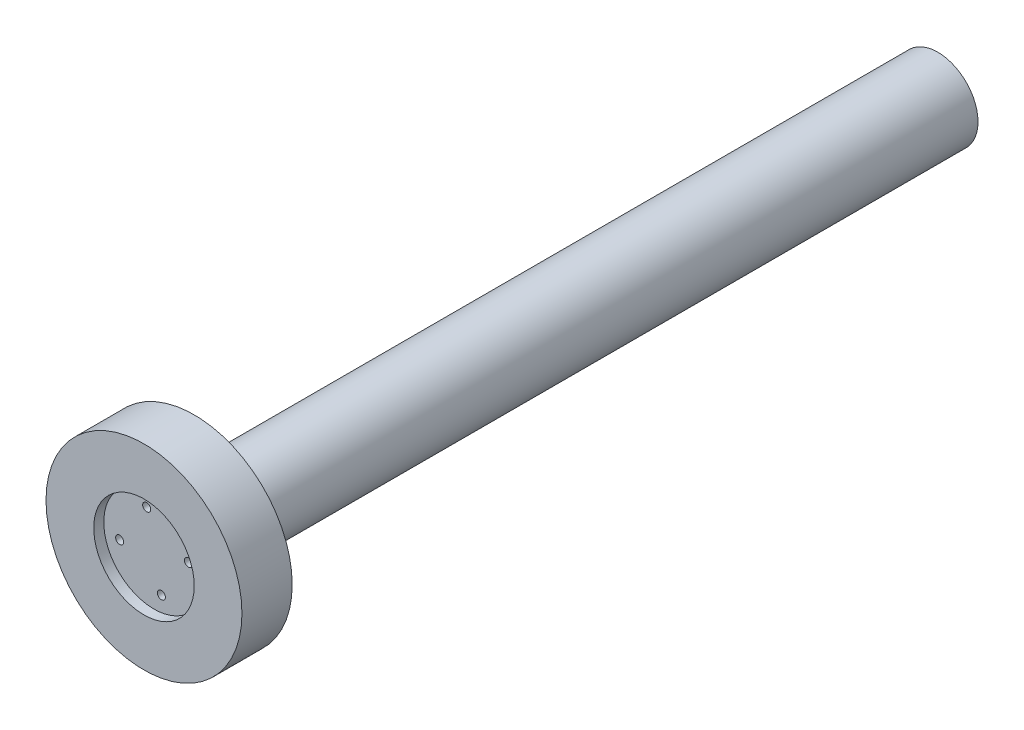
ISO-10303-21;
HEADER;
FILE_DESCRIPTION(('STEP AP214'),'2;1');
FILE_NAME('part.step','',(''),(''),'','','');
FILE_SCHEMA(('AUTOMOTIVE_DESIGN { 1 0 10303 214 1 1 1 1 }'));
ENDSEC;
DATA;
#1=APPLICATION_CONTEXT('core data for automotive mechanical design processes');
#2=APPLICATION_PROTOCOL_DEFINITION('international standard','automotive_design',2000,#1);
#3=PRODUCT_CONTEXT('',#1,'mechanical');
#4=PRODUCT('Part','Part','',(#3));
#5=PRODUCT_RELATED_PRODUCT_CATEGORY('part','',(#4));
#6=PRODUCT_DEFINITION_FORMATION('','',#4);
#7=PRODUCT_DEFINITION_CONTEXT('part definition',#1,'design');
#8=PRODUCT_DEFINITION('design','',#6,#7);
#9=PRODUCT_DEFINITION_SHAPE('','',#8);
#10=(LENGTH_UNIT() NAMED_UNIT(*) SI_UNIT(.MILLI.,.METRE.));
#11=(NAMED_UNIT(*) PLANE_ANGLE_UNIT() SI_UNIT($,.RADIAN.));
#12=(NAMED_UNIT(*) SI_UNIT($,.STERADIAN.) SOLID_ANGLE_UNIT());
#13=UNCERTAINTY_MEASURE_WITH_UNIT(LENGTH_MEASURE(1.E-05),#10,'distance_accuracy_value','');
#14=(GEOMETRIC_REPRESENTATION_CONTEXT(3) GLOBAL_UNCERTAINTY_ASSIGNED_CONTEXT((#13)) GLOBAL_UNIT_ASSIGNED_CONTEXT((#10,
#11,#12)) REPRESENTATION_CONTEXT('',''));
#15=CARTESIAN_POINT('',(0.,0.,0.));
#16=DIRECTION('',(0.,0.,1.));
#17=DIRECTION('',(1.,0.,0.));
#18=AXIS2_PLACEMENT_3D('',#15,#16,#17);
#19=CARTESIAN_POINT('',(0.,0.,158.));
#20=DIRECTION('',(0.,0.,-1.));
#21=DIRECTION('',(-1.,0.,0.));
#22=AXIS2_PLACEMENT_3D('',#19,#20,#21);
#23=CYLINDRICAL_SURFACE('',#22,8.);
#24=CARTESIAN_POINT('',(0.,0.,0.));
#25=DIRECTION('',(0.,0.,1.));
#26=DIRECTION('',(1.,0.,0.));
#27=AXIS2_PLACEMENT_3D('',#24,#25,#26);
#28=CIRCLE('',#27,8.);
#29=CARTESIAN_POINT('',(8.,0.,0.));
#30=VERTEX_POINT('',#29);
#31=EDGE_CURVE('E41',#30,#30,#28,.T.);
#32=ORIENTED_EDGE('',*,*,#31,.T.);
#33=EDGE_LOOP('',(#32));
#34=FACE_BOUND('',#33,.T.);
#35=CARTESIAN_POINT('',(0.,0.,148.));
#36=DIRECTION('',(0.,0.,1.));
#37=DIRECTION('',(1.,0.,0.));
#38=AXIS2_PLACEMENT_3D('',#35,#36,#37);
#39=CIRCLE('',#38,8.);
#40=CARTESIAN_POINT('',(8.,0.,148.));
#41=VERTEX_POINT('',#40);
#42=EDGE_CURVE('E10',#41,#41,#39,.T.);
#43=ORIENTED_EDGE('',*,*,#42,.F.);
#44=EDGE_LOOP('',(#43));
#45=FACE_BOUND('',#44,.T.);
#46=ADVANCED_FACE('F35',(#34,#45),#23,.T.);
#47=CARTESIAN_POINT('',(0.,0.,0.));
#48=DIRECTION('',(0.,0.,1.));
#49=DIRECTION('',(1.,0.,0.));
#50=AXIS2_PLACEMENT_3D('',#47,#48,#49);
#51=PLANE('',#50);
#52=ORIENTED_EDGE('',*,*,#31,.F.);
#53=EDGE_LOOP('',(#52));
#54=FACE_BOUND('',#53,.T.);
#55=ADVANCED_FACE('F102',(#54),#51,.F.);
#56=CARTESIAN_POINT('',(0.,0.,148.));
#57=DIRECTION('',(0.,0.,1.));
#58=DIRECTION('',(1.,0.,0.));
#59=AXIS2_PLACEMENT_3D('',#56,#57,#58);
#60=CYLINDRICAL_SURFACE('',#59,19.5);
#61=CARTESIAN_POINT('',(0.,0.,148.));
#62=DIRECTION('',(0.,0.,1.));
#63=DIRECTION('',(1.,0.,0.));
#64=AXIS2_PLACEMENT_3D('',#61,#62,#63);
#65=CIRCLE('',#64,19.5);
#66=CARTESIAN_POINT('',(19.5,0.,148.));
#67=VERTEX_POINT('',#66);
#68=EDGE_CURVE('E45',#67,#67,#65,.T.);
#69=ORIENTED_EDGE('',*,*,#68,.T.);
#70=EDGE_LOOP('',(#69));
#71=FACE_BOUND('',#70,.T.);
#72=CARTESIAN_POINT('',(0.,0.,158.));
#73=DIRECTION('',(0.,0.,1.));
#74=DIRECTION('',(1.,0.,0.));
#75=AXIS2_PLACEMENT_3D('',#72,#73,#74);
#76=CIRCLE('',#75,19.5);
#77=CARTESIAN_POINT('',(19.5,0.,158.));
#78=VERTEX_POINT('',#77);
#79=EDGE_CURVE('E49',#78,#78,#76,.T.);
#80=ORIENTED_EDGE('',*,*,#79,.F.);
#81=EDGE_LOOP('',(#80));
#82=FACE_BOUND('',#81,.T.);
#83=ADVANCED_FACE('F106',(#71,#82),#60,.T.);
#84=CARTESIAN_POINT('',(0.,0.,148.));
#85=DIRECTION('',(0.,0.,1.));
#86=DIRECTION('',(1.,0.,0.));
#87=AXIS2_PLACEMENT_3D('',#84,#85,#86);
#88=PLANE('',#87);
#89=ORIENTED_EDGE('',*,*,#42,.T.);
#90=EDGE_LOOP('',(#89));
#91=FACE_BOUND('',#90,.T.);
#92=ORIENTED_EDGE('',*,*,#68,.F.);
#93=EDGE_LOOP('',(#92));
#94=FACE_BOUND('',#93,.T.);
#95=ADVANCED_FACE('F112',(#91,#94),#88,.F.);
#96=CARTESIAN_POINT('',(0.,0.,158.));
#97=DIRECTION('',(0.,0.,1.));
#98=DIRECTION('',(1.,0.,0.));
#99=AXIS2_PLACEMENT_3D('',#96,#97,#98);
#100=PLANE('',#99);
#101=CARTESIAN_POINT('',(0.,0.,158.));
#102=DIRECTION('',(0.,0.,1.));
#103=DIRECTION('',(1.,0.,0.));
#104=AXIS2_PLACEMENT_3D('',#101,#102,#103);
#105=CIRCLE('',#104,10.0000000000001);
#106=CARTESIAN_POINT('',(10.0000000000001,0.,158.));
#107=VERTEX_POINT('',#106);
#108=EDGE_CURVE('E55',#107,#107,#105,.T.);
#109=ORIENTED_EDGE('',*,*,#108,.F.);
#110=EDGE_LOOP('',(#109));
#111=FACE_BOUND('',#110,.T.);
#112=ORIENTED_EDGE('',*,*,#79,.T.);
#113=EDGE_LOOP('',(#112));
#114=FACE_BOUND('',#113,.T.);
#115=ADVANCED_FACE('F116',(#111,#114),#100,.T.);
#116=CARTESIAN_POINT('',(0.,0.,156.));
#117=DIRECTION('',(0.,0.,1.));
#118=DIRECTION('',(1.,0.,0.));
#119=AXIS2_PLACEMENT_3D('',#116,#117,#118);
#120=CYLINDRICAL_SURFACE('',#119,10.0000000000001);
#121=CARTESIAN_POINT('',(0.,0.,156.));
#122=DIRECTION('',(0.,0.,1.));
#123=DIRECTION('',(1.,0.,0.));
#124=AXIS2_PLACEMENT_3D('',#121,#122,#123);
#125=CIRCLE('',#124,10.0000000000001);
#126=CARTESIAN_POINT('',(10.0000000000001,0.,156.));
#127=VERTEX_POINT('',#126);
#128=EDGE_CURVE('E53',#127,#127,#125,.T.);
#129=ORIENTED_EDGE('',*,*,#128,.F.);
#130=EDGE_LOOP('',(#129));
#131=FACE_BOUND('',#130,.T.);
#132=ORIENTED_EDGE('',*,*,#108,.T.);
#133=EDGE_LOOP('',(#132));
#134=FACE_BOUND('',#133,.T.);
#135=ADVANCED_FACE('F118',(#131,#134),#120,.F.);
#136=CARTESIAN_POINT('',(0.,0.,156.));
#137=DIRECTION('',(0.,0.,1.));
#138=DIRECTION('',(1.,0.,0.));
#139=AXIS2_PLACEMENT_3D('',#136,#137,#138);
#140=PLANE('',#139);
#141=CARTESIAN_POINT('',(1.46509787466606,-6.84496079007387,156.));
#142=DIRECTION('',(0.,0.,1.));
#143=DIRECTION('',(1.,0.,0.));
#144=AXIS2_PLACEMENT_3D('',#141,#142,#143);
#145=CIRCLE('',#144,0.800000000000001);
#146=CARTESIAN_POINT('',(2.26509787466606,-6.84496079007387,156.));
#147=VERTEX_POINT('',#146);
#148=EDGE_CURVE('E69',#147,#147,#145,.T.);
#149=ORIENTED_EDGE('',*,*,#148,.F.);
#150=EDGE_LOOP('',(#149));
#151=FACE_BOUND('',#150,.T.);
#152=CARTESIAN_POINT('',(-6.84496079007389,-1.46509787466604,156.));
#153=DIRECTION('',(0.,0.,1.));
#154=DIRECTION('',(1.,0.,0.));
#155=AXIS2_PLACEMENT_3D('',#152,#153,#154);
#156=CIRCLE('',#155,0.800000000000001);
#157=CARTESIAN_POINT('',(-6.04496079007389,-1.46509787466604,156.));
#158=VERTEX_POINT('',#157);
#159=EDGE_CURVE('E58',#158,#158,#156,.T.);
#160=ORIENTED_EDGE('',*,*,#159,.F.);
#161=EDGE_LOOP('',(#160));
#162=FACE_BOUND('',#161,.T.);
#163=CARTESIAN_POINT('',(-1.46509787466606,6.84496079007392,156.));
#164=DIRECTION('',(0.,0.,1.));
#165=DIRECTION('',(1.,0.,0.));
#166=AXIS2_PLACEMENT_3D('',#163,#164,#165);
#167=CIRCLE('',#166,0.800000000000001);
#168=CARTESIAN_POINT('',(-0.665097874666057,6.84496079007392,156.));
#169=VERTEX_POINT('',#168);
#170=EDGE_CURVE('E63',#169,#169,#167,.T.);
#171=ORIENTED_EDGE('',*,*,#170,.F.);
#172=EDGE_LOOP('',(#171));
#173=FACE_BOUND('',#172,.T.);
#174=CARTESIAN_POINT('',(6.84496079007389,1.46509787466608,156.));
#175=DIRECTION('',(0.,0.,1.));
#176=DIRECTION('',(1.,0.,0.));
#177=AXIS2_PLACEMENT_3D('',#174,#175,#176);
#178=CIRCLE('',#177,0.800000000000001);
#179=CARTESIAN_POINT('',(7.64496079007389,1.46509787466608,156.));
#180=VERTEX_POINT('',#179);
#181=EDGE_CURVE('E66',#180,#180,#178,.T.);
#182=ORIENTED_EDGE('',*,*,#181,.F.);
#183=EDGE_LOOP('',(#182));
#184=FACE_BOUND('',#183,.T.);
#185=ORIENTED_EDGE('',*,*,#128,.T.);
#186=EDGE_LOOP('',(#185));
#187=FACE_BOUND('',#186,.T.);
#188=ADVANCED_FACE('F125',(#151,#162,#173,#184,#187),#140,.T.);
#189=CARTESIAN_POINT('',(6.84496079007389,1.46509787466608,150.));
#190=DIRECTION('',(0.,0.,1.));
#191=DIRECTION('',(1.,0.,0.));
#192=AXIS2_PLACEMENT_3D('',#189,#190,#191);
#193=CYLINDRICAL_SURFACE('',#192,0.800000000000001);
#194=ORIENTED_EDGE('',*,*,#181,.T.);
#195=EDGE_LOOP('',(#194));
#196=FACE_BOUND('',#195,.T.);
#197=CARTESIAN_POINT('',(6.84496079007389,1.46509787466608,150.));
#198=DIRECTION('',(0.,0.,1.));
#199=DIRECTION('',(1.,0.,0.));
#200=AXIS2_PLACEMENT_3D('',#197,#198,#199);
#201=CIRCLE('',#200,0.800000000000001);
#202=CARTESIAN_POINT('',(7.64496079007389,1.46509787466608,150.));
#203=VERTEX_POINT('',#202);
#204=EDGE_CURVE('E73',#203,#203,#201,.T.);
#205=ORIENTED_EDGE('',*,*,#204,.F.);
#206=EDGE_LOOP('',(#205));
#207=FACE_BOUND('',#206,.T.);
#208=ADVANCED_FACE('F129',(#196,#207),#193,.F.);
#209=CARTESIAN_POINT('',(6.84496079007389,1.46509787466608,150.));
#210=DIRECTION('',(0.,0.,1.));
#211=DIRECTION('',(1.,0.,0.));
#212=AXIS2_PLACEMENT_3D('',#209,#210,#211);
#213=PLANE('',#212);
#214=ORIENTED_EDGE('',*,*,#204,.T.);
#215=EDGE_LOOP('',(#214));
#216=FACE_BOUND('',#215,.T.);
#217=ADVANCED_FACE('F131',(#216),#213,.T.);
#218=CARTESIAN_POINT('',(1.46509787466606,-6.84496079007387,150.));
#219=DIRECTION('',(0.,0.,1.));
#220=DIRECTION('',(1.,0.,0.));
#221=AXIS2_PLACEMENT_3D('',#218,#219,#220);
#222=CYLINDRICAL_SURFACE('',#221,0.800000000000001);
#223=ORIENTED_EDGE('',*,*,#148,.T.);
#224=EDGE_LOOP('',(#223));
#225=FACE_BOUND('',#224,.T.);
#226=CARTESIAN_POINT('',(1.46509787466606,-6.84496079007387,150.));
#227=DIRECTION('',(0.,0.,1.));
#228=DIRECTION('',(1.,0.,0.));
#229=AXIS2_PLACEMENT_3D('',#226,#227,#228);
#230=CIRCLE('',#229,0.800000000000001);
#231=CARTESIAN_POINT('',(2.26509787466606,-6.84496079007387,150.));
#232=VERTEX_POINT('',#231);
#233=EDGE_CURVE('E76',#232,#232,#230,.T.);
#234=ORIENTED_EDGE('',*,*,#233,.F.);
#235=EDGE_LOOP('',(#234));
#236=FACE_BOUND('',#235,.T.);
#237=ADVANCED_FACE('F134',(#225,#236),#222,.F.);
#238=CARTESIAN_POINT('',(1.46509787466606,-6.84496079007387,150.));
#239=DIRECTION('',(0.,0.,1.));
#240=DIRECTION('',(1.,0.,0.));
#241=AXIS2_PLACEMENT_3D('',#238,#239,#240);
#242=PLANE('',#241);
#243=ORIENTED_EDGE('',*,*,#233,.T.);
#244=EDGE_LOOP('',(#243));
#245=FACE_BOUND('',#244,.T.);
#246=ADVANCED_FACE('F139',(#245),#242,.T.);
#247=CARTESIAN_POINT('',(-6.84496079007389,-1.46509787466604,150.));
#248=DIRECTION('',(0.,0.,1.));
#249=DIRECTION('',(1.,0.,0.));
#250=AXIS2_PLACEMENT_3D('',#247,#248,#249);
#251=CYLINDRICAL_SURFACE('',#250,0.800000000000001);
#252=ORIENTED_EDGE('',*,*,#159,.T.);
#253=EDGE_LOOP('',(#252));
#254=FACE_BOUND('',#253,.T.);
#255=CARTESIAN_POINT('',(-6.84496079007389,-1.46509787466604,150.));
#256=DIRECTION('',(0.,0.,1.));
#257=DIRECTION('',(1.,0.,0.));
#258=AXIS2_PLACEMENT_3D('',#255,#256,#257);
#259=CIRCLE('',#258,0.800000000000001);
#260=CARTESIAN_POINT('',(-6.04496079007389,-1.46509787466604,150.));
#261=VERTEX_POINT('',#260);
#262=EDGE_CURVE('E79',#261,#261,#259,.T.);
#263=ORIENTED_EDGE('',*,*,#262,.F.);
#264=EDGE_LOOP('',(#263));
#265=FACE_BOUND('',#264,.T.);
#266=ADVANCED_FACE('F97',(#254,#265),#251,.F.);
#267=CARTESIAN_POINT('',(-6.84496079007389,-1.46509787466604,150.));
#268=DIRECTION('',(0.,0.,1.));
#269=DIRECTION('',(1.,0.,0.));
#270=AXIS2_PLACEMENT_3D('',#267,#268,#269);
#271=PLANE('',#270);
#272=ORIENTED_EDGE('',*,*,#262,.T.);
#273=EDGE_LOOP('',(#272));
#274=FACE_BOUND('',#273,.T.);
#275=ADVANCED_FACE('F89',(#274),#271,.T.);
#276=CARTESIAN_POINT('',(-1.46509787466606,6.84496079007392,150.));
#277=DIRECTION('',(0.,0.,1.));
#278=DIRECTION('',(1.,0.,0.));
#279=AXIS2_PLACEMENT_3D('',#276,#277,#278);
#280=CYLINDRICAL_SURFACE('',#279,0.800000000000001);
#281=ORIENTED_EDGE('',*,*,#170,.T.);
#282=EDGE_LOOP('',(#281));
#283=FACE_BOUND('',#282,.T.);
#284=CARTESIAN_POINT('',(-1.46509787466606,6.84496079007392,150.));
#285=DIRECTION('',(0.,0.,1.));
#286=DIRECTION('',(1.,0.,0.));
#287=AXIS2_PLACEMENT_3D('',#284,#285,#286);
#288=CIRCLE('',#287,0.800000000000001);
#289=CARTESIAN_POINT('',(-0.665097874666057,6.84496079007392,150.));
#290=VERTEX_POINT('',#289);
#291=EDGE_CURVE('E72',#290,#290,#288,.T.);
#292=ORIENTED_EDGE('',*,*,#291,.F.);
#293=EDGE_LOOP('',(#292));
#294=FACE_BOUND('',#293,.T.);
#295=ADVANCED_FACE('F87',(#283,#294),#280,.F.);
#296=CARTESIAN_POINT('',(-1.46509787466606,6.84496079007392,150.));
#297=DIRECTION('',(0.,0.,1.));
#298=DIRECTION('',(1.,0.,0.));
#299=AXIS2_PLACEMENT_3D('',#296,#297,#298);
#300=PLANE('',#299);
#301=ORIENTED_EDGE('',*,*,#291,.T.);
#302=EDGE_LOOP('',(#301));
#303=FACE_BOUND('',#302,.T.);
#304=ADVANCED_FACE('F85',(#303),#300,.T.);
#305=CLOSED_SHELL('',(#46,#55,#83,#95,#115,#135,#188,#208,#217,#237,#246,#266,#275,#295,#304));
#306=MANIFOLD_SOLID_BREP('B2',#305);
#307=ADVANCED_BREP_SHAPE_REPRESENTATION('',(#18,#306),#14);
#308=SHAPE_DEFINITION_REPRESENTATION(#9,#307);
ENDSEC;
END-ISO-10303-21;
